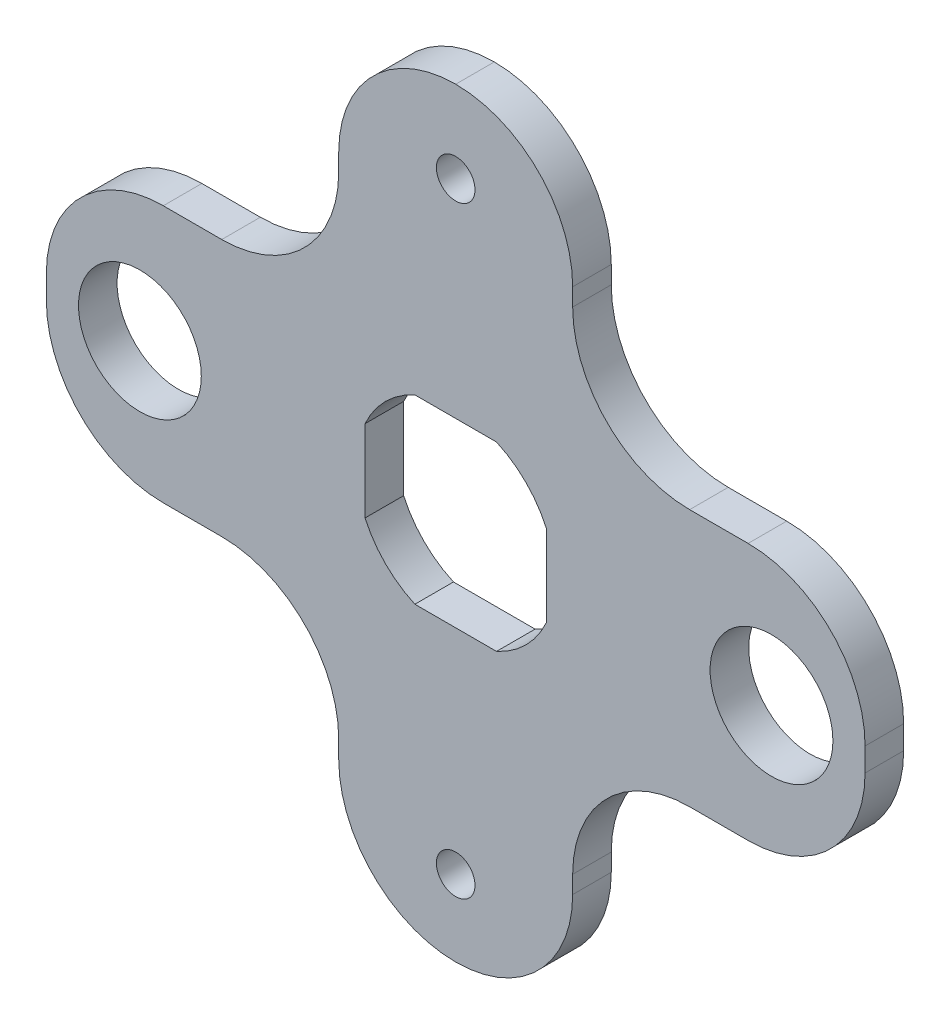
ISO-10303-21;
HEADER;
FILE_DESCRIPTION(('STEP AP214'),'2;1');
FILE_NAME('part.step','',(''),(''),'','','');
FILE_SCHEMA(('AUTOMOTIVE_DESIGN { 1 0 10303 214 1 1 1 1 }'));
ENDSEC;
DATA;
#1=APPLICATION_CONTEXT('core data for automotive mechanical design processes');
#2=APPLICATION_PROTOCOL_DEFINITION('international standard','automotive_design',2000,#1);
#3=PRODUCT_CONTEXT('',#1,'mechanical');
#4=PRODUCT('Part','Part','',(#3));
#5=PRODUCT_RELATED_PRODUCT_CATEGORY('part','',(#4));
#6=PRODUCT_DEFINITION_FORMATION('','',#4);
#7=PRODUCT_DEFINITION_CONTEXT('part definition',#1,'design');
#8=PRODUCT_DEFINITION('design','',#6,#7);
#9=PRODUCT_DEFINITION_SHAPE('','',#8);
#10=(LENGTH_UNIT() NAMED_UNIT(*) SI_UNIT(.MILLI.,.METRE.));
#11=(NAMED_UNIT(*) PLANE_ANGLE_UNIT() SI_UNIT($,.RADIAN.));
#12=(NAMED_UNIT(*) SI_UNIT($,.STERADIAN.) SOLID_ANGLE_UNIT());
#13=UNCERTAINTY_MEASURE_WITH_UNIT(LENGTH_MEASURE(1.E-05),#10,'distance_accuracy_value','');
#14=(GEOMETRIC_REPRESENTATION_CONTEXT(3) GLOBAL_UNCERTAINTY_ASSIGNED_CONTEXT((#13)) GLOBAL_UNIT_ASSIGNED_CONTEXT((#10,
#11,#12)) REPRESENTATION_CONTEXT('',''));
#15=CARTESIAN_POINT('',(0.,0.,0.));
#16=DIRECTION('',(0.,0.,1.));
#17=DIRECTION('',(1.,0.,0.));
#18=AXIS2_PLACEMENT_3D('',#15,#16,#17);
#19=CARTESIAN_POINT('',(0.,-3.25,3.3));
#20=DIRECTION('',(0.,-1.,0.));
#21=DIRECTION('',(1.,0.,0.));
#22=AXIS2_PLACEMENT_3D('',#19,#20,#21);
#23=PLANE('',#22);
#24=DIRECTION('',(-1.,0.,0.));
#25=VECTOR('',#24,1.);
#26=CARTESIAN_POINT('',(0.,-3.25,3.3));
#27=LINE('',#26,#25);
#28=CARTESIAN_POINT('',(-12.25,-3.25,3.3));
#29=VERTEX_POINT('',#28);
#30=CARTESIAN_POINT('',(-17.25,-3.25,3.3));
#31=VERTEX_POINT('',#30);
#32=EDGE_CURVE('E293',#29,#31,#27,.T.);
#33=ORIENTED_EDGE('',*,*,#32,.T.);
#34=DIRECTION('',(0.,0.,-1.));
#35=VECTOR('',#34,1.);
#36=CARTESIAN_POINT('',(-17.25,-3.25,3.3));
#37=LINE('',#36,#35);
#38=CARTESIAN_POINT('',(-17.25,-3.25,0.));
#39=VERTEX_POINT('',#38);
#40=EDGE_CURVE('E440',#31,#39,#37,.T.);
#41=ORIENTED_EDGE('',*,*,#40,.T.);
#42=DIRECTION('',(-1.,0.,0.));
#43=VECTOR('',#42,1.);
#44=CARTESIAN_POINT('',(0.,-3.25,0.));
#45=LINE('',#44,#43);
#46=CARTESIAN_POINT('',(-12.25,-3.25,0.));
#47=VERTEX_POINT('',#46);
#48=EDGE_CURVE('E357',#47,#39,#45,.T.);
#49=ORIENTED_EDGE('',*,*,#48,.F.);
#50=DIRECTION('',(0.,0.,-1.));
#51=VECTOR('',#50,1.);
#52=CARTESIAN_POINT('',(-12.25,-3.25,3.3));
#53=LINE('',#52,#51);
#54=EDGE_CURVE('E438',#47,#29,#53,.F.);
#55=ORIENTED_EDGE('',*,*,#54,.T.);
#56=EDGE_LOOP('',(#33,#41,#49,#55));
#57=FACE_BOUND('',#56,.T.);
#58=ADVANCED_FACE('F39',(#57),#23,.T.);
#59=CARTESIAN_POINT('',(-2.25,0.,3.3));
#60=DIRECTION('',(-1.,0.,0.));
#61=DIRECTION('',(0.,-1.,0.));
#62=AXIS2_PLACEMENT_3D('',#59,#60,#61);
#63=PLANE('',#62);
#64=DIRECTION('',(0.,1.,0.));
#65=VECTOR('',#64,1.);
#66=CARTESIAN_POINT('',(-2.25,0.,3.3));
#67=LINE('',#66,#65);
#68=CARTESIAN_POINT('',(-2.25,-14.75,3.3));
#69=VERTEX_POINT('',#68);
#70=CARTESIAN_POINT('',(-2.25,-13.25,3.3));
#71=VERTEX_POINT('',#70);
#72=EDGE_CURVE('E296',#69,#71,#67,.T.);
#73=ORIENTED_EDGE('',*,*,#72,.T.);
#74=DIRECTION('',(0.,0.,-1.));
#75=VECTOR('',#74,1.);
#76=CARTESIAN_POINT('',(-2.25,-13.25,0.));
#77=LINE('',#76,#75);
#78=CARTESIAN_POINT('',(-2.25,-13.25,0.));
#79=VERTEX_POINT('',#78);
#80=EDGE_CURVE('E446',#71,#79,#77,.T.);
#81=ORIENTED_EDGE('',*,*,#80,.T.);
#82=DIRECTION('',(0.,1.,0.));
#83=VECTOR('',#82,1.);
#84=CARTESIAN_POINT('',(-2.25,0.,0.));
#85=LINE('',#84,#83);
#86=CARTESIAN_POINT('',(-2.25,-14.75,0.));
#87=VERTEX_POINT('',#86);
#88=EDGE_CURVE('E360',#87,#79,#85,.T.);
#89=ORIENTED_EDGE('',*,*,#88,.F.);
#90=DIRECTION('',(0.,0.,-1.));
#91=VECTOR('',#90,1.);
#92=CARTESIAN_POINT('',(-2.25,-14.75,3.3));
#93=LINE('',#92,#91);
#94=EDGE_CURVE('E443',#87,#69,#93,.F.);
#95=ORIENTED_EDGE('',*,*,#94,.T.);
#96=EDGE_LOOP('',(#73,#81,#89,#95));
#97=FACE_BOUND('',#96,.T.);
#98=ADVANCED_FACE('F552',(#97),#63,.T.);
#99=CARTESIAN_POINT('',(17.75,0.,3.3));
#100=DIRECTION('',(1.,0.,0.));
#101=DIRECTION('',(0.,0.,-1.));
#102=AXIS2_PLACEMENT_3D('',#99,#100,#101);
#103=PLANE('',#102);
#104=DIRECTION('',(0.,-1.,0.));
#105=VECTOR('',#104,1.);
#106=CARTESIAN_POINT('',(17.75,0.,3.3));
#107=LINE('',#106,#105);
#108=CARTESIAN_POINT('',(17.75,-13.25,3.3));
#109=VERTEX_POINT('',#108);
#110=CARTESIAN_POINT('',(17.75,-14.75,3.3));
#111=VERTEX_POINT('',#110);
#112=EDGE_CURVE('E299',#109,#111,#107,.T.);
#113=ORIENTED_EDGE('',*,*,#112,.T.);
#114=DIRECTION('',(0.,0.,-1.));
#115=VECTOR('',#114,1.);
#116=CARTESIAN_POINT('',(17.75,-14.75,3.3));
#117=LINE('',#116,#115);
#118=CARTESIAN_POINT('',(17.75,-14.75,0.));
#119=VERTEX_POINT('',#118);
#120=EDGE_CURVE('E451',#111,#119,#117,.T.);
#121=ORIENTED_EDGE('',*,*,#120,.T.);
#122=DIRECTION('',(0.,-1.,0.));
#123=VECTOR('',#122,1.);
#124=CARTESIAN_POINT('',(17.75,0.,0.));
#125=LINE('',#124,#123);
#126=CARTESIAN_POINT('',(17.75,-13.25,0.));
#127=VERTEX_POINT('',#126);
#128=EDGE_CURVE('E363',#127,#119,#125,.T.);
#129=ORIENTED_EDGE('',*,*,#128,.F.);
#130=DIRECTION('',(0.,0.,-1.));
#131=VECTOR('',#130,1.);
#132=CARTESIAN_POINT('',(17.75,-13.25,3.3));
#133=LINE('',#132,#131);
#134=EDGE_CURVE('E449',#127,#109,#133,.F.);
#135=ORIENTED_EDGE('',*,*,#134,.T.);
#136=EDGE_LOOP('',(#113,#121,#129,#135));
#137=FACE_BOUND('',#136,.T.);
#138=ADVANCED_FACE('F543',(#137),#103,.T.);
#139=CARTESIAN_POINT('',(0.,-3.25,3.3));
#140=DIRECTION('',(0.,-1.,0.));
#141=DIRECTION('',(1.,0.,0.));
#142=AXIS2_PLACEMENT_3D('',#139,#140,#141);
#143=PLANE('',#142);
#144=DIRECTION('',(-1.,0.,0.));
#145=VECTOR('',#144,1.);
#146=CARTESIAN_POINT('',(0.,-3.25,3.3));
#147=LINE('',#146,#145);
#148=CARTESIAN_POINT('',(32.75,-3.25,3.3));
#149=VERTEX_POINT('',#148);
#150=CARTESIAN_POINT('',(27.75,-3.25,3.3));
#151=VERTEX_POINT('',#150);
#152=EDGE_CURVE('E302',#149,#151,#147,.T.);
#153=ORIENTED_EDGE('',*,*,#152,.T.);
#154=DIRECTION('',(0.,0.,-1.));
#155=VECTOR('',#154,1.);
#156=CARTESIAN_POINT('',(27.75,-3.25,0.));
#157=LINE('',#156,#155);
#158=CARTESIAN_POINT('',(27.75,-3.25,0.));
#159=VERTEX_POINT('',#158);
#160=EDGE_CURVE('E455',#151,#159,#157,.T.);
#161=ORIENTED_EDGE('',*,*,#160,.T.);
#162=DIRECTION('',(-1.,0.,0.));
#163=VECTOR('',#162,1.);
#164=CARTESIAN_POINT('',(0.,-3.25,0.));
#165=LINE('',#164,#163);
#166=CARTESIAN_POINT('',(32.75,-3.25,0.));
#167=VERTEX_POINT('',#166);
#168=EDGE_CURVE('E366',#167,#159,#165,.T.);
#169=ORIENTED_EDGE('',*,*,#168,.F.);
#170=DIRECTION('',(0.,0.,-1.));
#171=VECTOR('',#170,1.);
#172=CARTESIAN_POINT('',(32.75,-3.25,3.3));
#173=LINE('',#172,#171);
#174=EDGE_CURVE('E453',#167,#149,#173,.F.);
#175=ORIENTED_EDGE('',*,*,#174,.T.);
#176=EDGE_LOOP('',(#153,#161,#169,#175));
#177=FACE_BOUND('',#176,.T.);
#178=ADVANCED_FACE('F533',(#177),#143,.T.);
#179=CARTESIAN_POINT('',(42.75,0.,3.3));
#180=DIRECTION('',(1.,0.,0.));
#181=DIRECTION('',(0.,0.,-1.));
#182=AXIS2_PLACEMENT_3D('',#179,#180,#181);
#183=PLANE('',#182);
#184=DIRECTION('',(0.,-1.,0.));
#185=VECTOR('',#184,1.);
#186=CARTESIAN_POINT('',(42.75,0.,3.3));
#187=LINE('',#186,#185);
#188=CARTESIAN_POINT('',(42.75,8.75,3.3));
#189=VERTEX_POINT('',#188);
#190=CARTESIAN_POINT('',(42.75,6.75,3.3));
#191=VERTEX_POINT('',#190);
#192=EDGE_CURVE('E305',#189,#191,#187,.T.);
#193=ORIENTED_EDGE('',*,*,#192,.T.);
#194=DIRECTION('',(0.,0.,-1.));
#195=VECTOR('',#194,1.);
#196=CARTESIAN_POINT('',(42.75,6.75,3.3));
#197=LINE('',#196,#195);
#198=CARTESIAN_POINT('',(42.75,6.75,0.));
#199=VERTEX_POINT('',#198);
#200=EDGE_CURVE('E460',#191,#199,#197,.T.);
#201=ORIENTED_EDGE('',*,*,#200,.T.);
#202=DIRECTION('',(0.,-1.,0.));
#203=VECTOR('',#202,1.);
#204=CARTESIAN_POINT('',(42.75,0.,0.));
#205=LINE('',#204,#203);
#206=CARTESIAN_POINT('',(42.75,8.75,0.));
#207=VERTEX_POINT('',#206);
#208=EDGE_CURVE('E369',#207,#199,#205,.T.);
#209=ORIENTED_EDGE('',*,*,#208,.F.);
#210=DIRECTION('',(0.,0.,-1.));
#211=VECTOR('',#210,1.);
#212=CARTESIAN_POINT('',(42.75,8.75,3.3));
#213=LINE('',#212,#211);
#214=EDGE_CURVE('E458',#207,#189,#213,.F.);
#215=ORIENTED_EDGE('',*,*,#214,.T.);
#216=EDGE_LOOP('',(#193,#201,#209,#215));
#217=FACE_BOUND('',#216,.T.);
#218=ADVANCED_FACE('F524',(#217),#183,.T.);
#219=CARTESIAN_POINT('',(0.,18.75,3.3));
#220=DIRECTION('',(0.,1.,0.));
#221=DIRECTION('',(0.,0.,1.));
#222=AXIS2_PLACEMENT_3D('',#219,#220,#221);
#223=PLANE('',#222);
#224=DIRECTION('',(1.,0.,0.));
#225=VECTOR('',#224,1.);
#226=CARTESIAN_POINT('',(0.,18.75,3.3));
#227=LINE('',#226,#225);
#228=CARTESIAN_POINT('',(27.75,18.75,3.3));
#229=VERTEX_POINT('',#228);
#230=CARTESIAN_POINT('',(32.75,18.75,3.3));
#231=VERTEX_POINT('',#230);
#232=EDGE_CURVE('E308',#229,#231,#227,.T.);
#233=ORIENTED_EDGE('',*,*,#232,.T.);
#234=DIRECTION('',(0.,0.,-1.));
#235=VECTOR('',#234,1.);
#236=CARTESIAN_POINT('',(32.75,18.75,3.3));
#237=LINE('',#236,#235);
#238=CARTESIAN_POINT('',(32.75,18.75,0.));
#239=VERTEX_POINT('',#238);
#240=EDGE_CURVE('E465',#231,#239,#237,.T.);
#241=ORIENTED_EDGE('',*,*,#240,.T.);
#242=DIRECTION('',(1.,0.,0.));
#243=VECTOR('',#242,1.);
#244=CARTESIAN_POINT('',(0.,18.75,0.));
#245=LINE('',#244,#243);
#246=CARTESIAN_POINT('',(27.75,18.75,0.));
#247=VERTEX_POINT('',#246);
#248=EDGE_CURVE('E372',#247,#239,#245,.T.);
#249=ORIENTED_EDGE('',*,*,#248,.F.);
#250=DIRECTION('',(0.,0.,-1.));
#251=VECTOR('',#250,1.);
#252=CARTESIAN_POINT('',(27.75,18.75,3.3));
#253=LINE('',#252,#251);
#254=EDGE_CURVE('E463',#247,#229,#253,.F.);
#255=ORIENTED_EDGE('',*,*,#254,.T.);
#256=EDGE_LOOP('',(#233,#241,#249,#255));
#257=FACE_BOUND('',#256,.T.);
#258=ADVANCED_FACE('F515',(#257),#223,.T.);
#259=CARTESIAN_POINT('',(17.75,0.,3.3));
#260=DIRECTION('',(1.,0.,0.));
#261=DIRECTION('',(0.,0.,-1.));
#262=AXIS2_PLACEMENT_3D('',#259,#260,#261);
#263=PLANE('',#262);
#264=DIRECTION('',(0.,-1.,0.));
#265=VECTOR('',#264,1.);
#266=CARTESIAN_POINT('',(17.75,0.,3.3));
#267=LINE('',#266,#265);
#268=CARTESIAN_POINT('',(17.75,30.25,3.3));
#269=VERTEX_POINT('',#268);
#270=CARTESIAN_POINT('',(17.75,28.75,3.3));
#271=VERTEX_POINT('',#270);
#272=EDGE_CURVE('E311',#269,#271,#267,.T.);
#273=ORIENTED_EDGE('',*,*,#272,.T.);
#274=DIRECTION('',(0.,0.,-1.));
#275=VECTOR('',#274,1.);
#276=CARTESIAN_POINT('',(17.75,28.75,0.));
#277=LINE('',#276,#275);
#278=CARTESIAN_POINT('',(17.75,28.75,0.));
#279=VERTEX_POINT('',#278);
#280=EDGE_CURVE('E470',#271,#279,#277,.T.);
#281=ORIENTED_EDGE('',*,*,#280,.T.);
#282=DIRECTION('',(0.,-1.,0.));
#283=VECTOR('',#282,1.);
#284=CARTESIAN_POINT('',(17.75,0.,0.));
#285=LINE('',#284,#283);
#286=CARTESIAN_POINT('',(17.75,30.25,0.));
#287=VERTEX_POINT('',#286);
#288=EDGE_CURVE('E375',#287,#279,#285,.T.);
#289=ORIENTED_EDGE('',*,*,#288,.F.);
#290=DIRECTION('',(0.,0.,-1.));
#291=VECTOR('',#290,1.);
#292=CARTESIAN_POINT('',(17.75,30.25,3.3));
#293=LINE('',#292,#291);
#294=EDGE_CURVE('E468',#287,#269,#293,.F.);
#295=ORIENTED_EDGE('',*,*,#294,.T.);
#296=EDGE_LOOP('',(#273,#281,#289,#295));
#297=FACE_BOUND('',#296,.T.);
#298=ADVANCED_FACE('F506',(#297),#263,.T.);
#299=CARTESIAN_POINT('',(-2.25,0.,3.3));
#300=DIRECTION('',(-1.,0.,0.));
#301=DIRECTION('',(0.,-1.,0.));
#302=AXIS2_PLACEMENT_3D('',#299,#300,#301);
#303=PLANE('',#302);
#304=DIRECTION('',(0.,1.,0.));
#305=VECTOR('',#304,1.);
#306=CARTESIAN_POINT('',(-2.25,0.,0.));
#307=LINE('',#306,#305);
#308=CARTESIAN_POINT('',(-2.25,28.75,0.));
#309=VERTEX_POINT('',#308);
#310=CARTESIAN_POINT('',(-2.25,30.25,0.));
#311=VERTEX_POINT('',#310);
#312=EDGE_CURVE('E378',#309,#311,#307,.T.);
#313=ORIENTED_EDGE('',*,*,#312,.F.);
#314=DIRECTION('',(0.,0.,-1.));
#315=VECTOR('',#314,1.);
#316=CARTESIAN_POINT('',(-2.25,28.75,3.3));
#317=LINE('',#316,#315);
#318=CARTESIAN_POINT('',(-2.25,28.75,3.3));
#319=VERTEX_POINT('',#318);
#320=EDGE_CURVE('E63',#309,#319,#317,.F.);
#321=ORIENTED_EDGE('',*,*,#320,.T.);
#322=DIRECTION('',(0.,1.,0.));
#323=VECTOR('',#322,1.);
#324=CARTESIAN_POINT('',(-2.25,0.,3.3));
#325=LINE('',#324,#323);
#326=CARTESIAN_POINT('',(-2.25,30.25,3.3));
#327=VERTEX_POINT('',#326);
#328=EDGE_CURVE('E314',#319,#327,#325,.T.);
#329=ORIENTED_EDGE('',*,*,#328,.T.);
#330=DIRECTION('',(0.,0.,-1.));
#331=VECTOR('',#330,1.);
#332=CARTESIAN_POINT('',(-2.25,30.25,3.3));
#333=LINE('',#332,#331);
#334=EDGE_CURVE('E473',#327,#311,#333,.T.);
#335=ORIENTED_EDGE('',*,*,#334,.T.);
#336=EDGE_LOOP('',(#313,#321,#329,#335));
#337=FACE_BOUND('',#336,.T.);
#338=ADVANCED_FACE('F585',(#337),#303,.T.);
#339=CARTESIAN_POINT('',(0.,18.75,3.3));
#340=DIRECTION('',(0.,1.,0.));
#341=DIRECTION('',(0.,0.,1.));
#342=AXIS2_PLACEMENT_3D('',#339,#340,#341);
#343=PLANE('',#342);
#344=DIRECTION('',(1.,0.,0.));
#345=VECTOR('',#344,1.);
#346=CARTESIAN_POINT('',(0.,18.75,0.));
#347=LINE('',#346,#345);
#348=CARTESIAN_POINT('',(-17.25,18.75,0.));
#349=VERTEX_POINT('',#348);
#350=CARTESIAN_POINT('',(-12.25,18.75,0.));
#351=VERTEX_POINT('',#350);
#352=EDGE_CURVE('E381',#349,#351,#347,.T.);
#353=ORIENTED_EDGE('',*,*,#352,.F.);
#354=DIRECTION('',(0.,0.,-1.));
#355=VECTOR('',#354,1.);
#356=CARTESIAN_POINT('',(-17.25,18.75,3.3));
#357=LINE('',#356,#355);
#358=CARTESIAN_POINT('',(-17.25,18.75,3.3));
#359=VERTEX_POINT('',#358);
#360=EDGE_CURVE('E421',#349,#359,#357,.F.);
#361=ORIENTED_EDGE('',*,*,#360,.T.);
#362=DIRECTION('',(1.,0.,0.));
#363=VECTOR('',#362,1.);
#364=CARTESIAN_POINT('',(0.,18.75,3.3));
#365=LINE('',#364,#363);
#366=CARTESIAN_POINT('',(-12.25,18.75,3.3));
#367=VERTEX_POINT('',#366);
#368=EDGE_CURVE('E316',#359,#367,#365,.T.);
#369=ORIENTED_EDGE('',*,*,#368,.T.);
#370=DIRECTION('',(0.,0.,-1.));
#371=VECTOR('',#370,1.);
#372=CARTESIAN_POINT('',(-12.25,18.75,0.));
#373=LINE('',#372,#371);
#374=EDGE_CURVE('E418',#367,#351,#373,.T.);
#375=ORIENTED_EDGE('',*,*,#374,.T.);
#376=EDGE_LOOP('',(#353,#361,#369,#375));
#377=FACE_BOUND('',#376,.T.);
#378=ADVANCED_FACE('F580',(#377),#343,.T.);
#379=CARTESIAN_POINT('',(7.75,7.75,3.3));
#380=DIRECTION('',(0.,0.,-1.));
#381=DIRECTION('',(-1.,0.,0.));
#382=AXIS2_PLACEMENT_3D('',#379,#380,#381);
#383=CYLINDRICAL_SURFACE('',#382,8.5);
#384=CARTESIAN_POINT('',(7.75,7.75,0.));
#385=DIRECTION('',(0.,0.,1.));
#386=DIRECTION('',(1.,0.,0.));
#387=AXIS2_PLACEMENT_3D('',#384,#385,#386);
#388=CIRCLE('',#387,8.5);
#389=CARTESIAN_POINT('',(15.5,11.2410600109422,0.));
#390=VERTEX_POINT('',#389);
#391=CARTESIAN_POINT('',(11.2410600109422,15.5,0.));
#392=VERTEX_POINT('',#391);
#393=EDGE_CURVE('E243',#390,#392,#388,.T.);
#394=ORIENTED_EDGE('',*,*,#393,.F.);
#395=DIRECTION('',(0.,0.,-1.));
#396=VECTOR('',#395,1.);
#397=CARTESIAN_POINT('',(15.5,11.2410600109422,3.3));
#398=LINE('',#397,#396);
#399=CARTESIAN_POINT('',(15.5,11.2410600109422,3.3));
#400=VERTEX_POINT('',#399);
#401=EDGE_CURVE('E238',#400,#390,#398,.T.);
#402=ORIENTED_EDGE('',*,*,#401,.F.);
#403=CARTESIAN_POINT('',(7.75,7.75,3.3));
#404=DIRECTION('',(0.,0.,1.));
#405=DIRECTION('',(1.,0.,0.));
#406=AXIS2_PLACEMENT_3D('',#403,#404,#405);
#407=CIRCLE('',#406,8.5);
#408=CARTESIAN_POINT('',(11.2410600109422,15.5,3.3));
#409=VERTEX_POINT('',#408);
#410=EDGE_CURVE('E241',#400,#409,#407,.T.);
#411=ORIENTED_EDGE('',*,*,#410,.T.);
#412=DIRECTION('',(0.,0.,-1.));
#413=VECTOR('',#412,1.);
#414=CARTESIAN_POINT('',(11.2410600109422,15.5,3.3));
#415=LINE('',#414,#413);
#416=EDGE_CURVE('E322',#409,#392,#415,.T.);
#417=ORIENTED_EDGE('',*,*,#416,.T.);
#418=EDGE_LOOP('',(#394,#402,#411,#417));
#419=FACE_BOUND('',#418,.T.);
#420=ADVANCED_FACE('F240',(#419),#383,.F.);
#421=CARTESIAN_POINT('',(15.5,0.,3.3));
#422=DIRECTION('',(-1.,0.,0.));
#423=DIRECTION('',(0.,0.,1.));
#424=AXIS2_PLACEMENT_3D('',#421,#422,#423);
#425=PLANE('',#424);
#426=DIRECTION('',(0.,1.,0.));
#427=VECTOR('',#426,1.);
#428=CARTESIAN_POINT('',(15.5,0.,0.));
#429=LINE('',#428,#427);
#430=CARTESIAN_POINT('',(15.5,4.25893998905776,0.));
#431=VERTEX_POINT('',#430);
#432=EDGE_CURVE('E324',#431,#390,#429,.T.);
#433=ORIENTED_EDGE('',*,*,#432,.F.);
#434=DIRECTION('',(0.,0.,-1.));
#435=VECTOR('',#434,1.);
#436=CARTESIAN_POINT('',(15.5,4.25893998905776,3.3));
#437=LINE('',#436,#435);
#438=CARTESIAN_POINT('',(15.5,4.25893998905776,3.3));
#439=VERTEX_POINT('',#438);
#440=EDGE_CURVE('E249',#439,#431,#437,.T.);
#441=ORIENTED_EDGE('',*,*,#440,.F.);
#442=DIRECTION('',(0.,1.,0.));
#443=VECTOR('',#442,1.);
#444=CARTESIAN_POINT('',(15.5,0.,3.3));
#445=LINE('',#444,#443);
#446=EDGE_CURVE('E256',#439,#400,#445,.T.);
#447=ORIENTED_EDGE('',*,*,#446,.T.);
#448=ORIENTED_EDGE('',*,*,#401,.T.);
#449=EDGE_LOOP('',(#433,#441,#447,#448));
#450=FACE_BOUND('',#449,.T.);
#451=ADVANCED_FACE('F264',(#450),#425,.T.);
#452=CARTESIAN_POINT('',(7.75,7.75,3.3));
#453=DIRECTION('',(0.,0.,-1.));
#454=DIRECTION('',(-1.,0.,0.));
#455=AXIS2_PLACEMENT_3D('',#452,#453,#454);
#456=CYLINDRICAL_SURFACE('',#455,8.5);
#457=CARTESIAN_POINT('',(7.75,7.75,0.));
#458=DIRECTION('',(0.,0.,1.));
#459=DIRECTION('',(1.,0.,0.));
#460=AXIS2_PLACEMENT_3D('',#457,#458,#459);
#461=CIRCLE('',#460,8.5);
#462=CARTESIAN_POINT('',(11.2410600109422,0.,0.));
#463=VERTEX_POINT('',#462);
#464=EDGE_CURVE('E327',#463,#431,#461,.T.);
#465=ORIENTED_EDGE('',*,*,#464,.F.);
#466=DIRECTION('',(0.,0.,-1.));
#467=VECTOR('',#466,1.);
#468=CARTESIAN_POINT('',(11.2410600109422,0.,3.3));
#469=LINE('',#468,#467);
#470=CARTESIAN_POINT('',(11.2410600109422,0.,3.3));
#471=VERTEX_POINT('',#470);
#472=EDGE_CURVE('E395',#471,#463,#469,.T.);
#473=ORIENTED_EDGE('',*,*,#472,.F.);
#474=CARTESIAN_POINT('',(7.75,7.75,3.3));
#475=DIRECTION('',(0.,0.,1.));
#476=DIRECTION('',(1.,0.,0.));
#477=AXIS2_PLACEMENT_3D('',#474,#475,#476);
#478=CIRCLE('',#477,8.5);
#479=EDGE_CURVE('E265',#471,#439,#478,.T.);
#480=ORIENTED_EDGE('',*,*,#479,.T.);
#481=ORIENTED_EDGE('',*,*,#440,.T.);
#482=EDGE_LOOP('',(#465,#473,#480,#481));
#483=FACE_BOUND('',#482,.T.);
#484=ADVANCED_FACE('F637',(#483),#456,.F.);
#485=CARTESIAN_POINT('',(0.,0.,3.3));
#486=DIRECTION('',(0.,1.,0.));
#487=DIRECTION('',(0.,0.,1.));
#488=AXIS2_PLACEMENT_3D('',#485,#486,#487);
#489=PLANE('',#488);
#490=DIRECTION('',(1.,0.,0.));
#491=VECTOR('',#490,1.);
#492=CARTESIAN_POINT('',(0.,0.,0.));
#493=LINE('',#492,#491);
#494=CARTESIAN_POINT('',(4.25893998905776,0.,0.));
#495=VERTEX_POINT('',#494);
#496=EDGE_CURVE('E330',#495,#463,#493,.T.);
#497=ORIENTED_EDGE('',*,*,#496,.F.);
#498=DIRECTION('',(0.,0.,-1.));
#499=VECTOR('',#498,1.);
#500=CARTESIAN_POINT('',(4.25893998905776,0.,3.3));
#501=LINE('',#500,#499);
#502=CARTESIAN_POINT('',(4.25893998905776,0.,3.3));
#503=VERTEX_POINT('',#502);
#504=EDGE_CURVE('E393',#503,#495,#501,.T.);
#505=ORIENTED_EDGE('',*,*,#504,.F.);
#506=DIRECTION('',(1.,0.,0.));
#507=VECTOR('',#506,1.);
#508=CARTESIAN_POINT('',(0.,0.,3.3));
#509=LINE('',#508,#507);
#510=EDGE_CURVE('E267',#503,#471,#509,.T.);
#511=ORIENTED_EDGE('',*,*,#510,.T.);
#512=ORIENTED_EDGE('',*,*,#472,.T.);
#513=EDGE_LOOP('',(#497,#505,#511,#512));
#514=FACE_BOUND('',#513,.T.);
#515=ADVANCED_FACE('F633',(#514),#489,.T.);
#516=CARTESIAN_POINT('',(7.75,7.75,3.3));
#517=DIRECTION('',(0.,0.,-1.));
#518=DIRECTION('',(-1.,0.,0.));
#519=AXIS2_PLACEMENT_3D('',#516,#517,#518);
#520=CYLINDRICAL_SURFACE('',#519,8.5);
#521=CARTESIAN_POINT('',(7.75,7.75,0.));
#522=DIRECTION('',(0.,0.,1.));
#523=DIRECTION('',(1.,0.,0.));
#524=AXIS2_PLACEMENT_3D('',#521,#522,#523);
#525=CIRCLE('',#524,8.5);
#526=CARTESIAN_POINT('',(0.,4.25893998905776,0.));
#527=VERTEX_POINT('',#526);
#528=EDGE_CURVE('E333',#527,#495,#525,.T.);
#529=ORIENTED_EDGE('',*,*,#528,.F.);
#530=DIRECTION('',(0.,0.,-1.));
#531=VECTOR('',#530,1.);
#532=CARTESIAN_POINT('',(0.,4.25893998905776,3.3));
#533=LINE('',#532,#531);
#534=CARTESIAN_POINT('',(0.,4.25893998905776,3.3));
#535=VERTEX_POINT('',#534);
#536=EDGE_CURVE('E391',#535,#527,#533,.T.);
#537=ORIENTED_EDGE('',*,*,#536,.F.);
#538=CARTESIAN_POINT('',(7.75,7.75,3.3));
#539=DIRECTION('',(0.,0.,1.));
#540=DIRECTION('',(1.,0.,0.));
#541=AXIS2_PLACEMENT_3D('',#538,#539,#540);
#542=CIRCLE('',#541,8.5);
#543=EDGE_CURVE('E272',#535,#503,#542,.T.);
#544=ORIENTED_EDGE('',*,*,#543,.T.);
#545=ORIENTED_EDGE('',*,*,#504,.T.);
#546=EDGE_LOOP('',(#529,#537,#544,#545));
#547=FACE_BOUND('',#546,.T.);
#548=ADVANCED_FACE('F629',(#547),#520,.F.);
#549=CARTESIAN_POINT('',(0.,0.,3.3));
#550=DIRECTION('',(-1.,0.,0.));
#551=DIRECTION('',(0.,0.,1.));
#552=AXIS2_PLACEMENT_3D('',#549,#550,#551);
#553=PLANE('',#552);
#554=DIRECTION('',(0.,1.,0.));
#555=VECTOR('',#554,1.);
#556=CARTESIAN_POINT('',(0.,0.,0.));
#557=LINE('',#556,#555);
#558=CARTESIAN_POINT('',(0.,11.2410600109422,0.));
#559=VERTEX_POINT('',#558);
#560=EDGE_CURVE('E336',#527,#559,#557,.T.);
#561=ORIENTED_EDGE('',*,*,#560,.T.);
#562=DIRECTION('',(0.,0.,-1.));
#563=VECTOR('',#562,1.);
#564=CARTESIAN_POINT('',(0.,11.2410600109422,3.3));
#565=LINE('',#564,#563);
#566=CARTESIAN_POINT('',(0.,11.2410600109422,3.3));
#567=VERTEX_POINT('',#566);
#568=EDGE_CURVE('E389',#567,#559,#565,.T.);
#569=ORIENTED_EDGE('',*,*,#568,.F.);
#570=DIRECTION('',(0.,1.,0.));
#571=VECTOR('',#570,1.);
#572=CARTESIAN_POINT('',(0.,0.,3.3));
#573=LINE('',#572,#571);
#574=EDGE_CURVE('E275',#535,#567,#573,.T.);
#575=ORIENTED_EDGE('',*,*,#574,.F.);
#576=ORIENTED_EDGE('',*,*,#536,.T.);
#577=EDGE_LOOP('',(#561,#569,#575,#576));
#578=FACE_BOUND('',#577,.T.);
#579=ADVANCED_FACE('F625',(#578),#553,.F.);
#580=CARTESIAN_POINT('',(7.75,7.75,3.3));
#581=DIRECTION('',(0.,0.,-1.));
#582=DIRECTION('',(-1.,0.,0.));
#583=AXIS2_PLACEMENT_3D('',#580,#581,#582);
#584=CYLINDRICAL_SURFACE('',#583,8.5);
#585=CARTESIAN_POINT('',(7.75,7.75,0.));
#586=DIRECTION('',(0.,0.,1.));
#587=DIRECTION('',(1.,0.,0.));
#588=AXIS2_PLACEMENT_3D('',#585,#586,#587);
#589=CIRCLE('',#588,8.5);
#590=CARTESIAN_POINT('',(4.25893998905776,15.5,0.));
#591=VERTEX_POINT('',#590);
#592=EDGE_CURVE('E339',#591,#559,#589,.T.);
#593=ORIENTED_EDGE('',*,*,#592,.F.);
#594=DIRECTION('',(0.,0.,-1.));
#595=VECTOR('',#594,1.);
#596=CARTESIAN_POINT('',(4.25893998905776,15.5,3.3));
#597=LINE('',#596,#595);
#598=CARTESIAN_POINT('',(4.25893998905776,15.5,3.3));
#599=VERTEX_POINT('',#598);
#600=EDGE_CURVE('E387',#599,#591,#597,.T.);
#601=ORIENTED_EDGE('',*,*,#600,.F.);
#602=CARTESIAN_POINT('',(7.75,7.75,3.3));
#603=DIRECTION('',(0.,0.,1.));
#604=DIRECTION('',(1.,0.,0.));
#605=AXIS2_PLACEMENT_3D('',#602,#603,#604);
#606=CIRCLE('',#605,8.5);
#607=EDGE_CURVE('E277',#599,#567,#606,.T.);
#608=ORIENTED_EDGE('',*,*,#607,.T.);
#609=ORIENTED_EDGE('',*,*,#568,.T.);
#610=EDGE_LOOP('',(#593,#601,#608,#609));
#611=FACE_BOUND('',#610,.T.);
#612=ADVANCED_FACE('F606',(#611),#584,.F.);
#613=CARTESIAN_POINT('',(34.75,7.75,3.3));
#614=DIRECTION('',(0.,0.,-1.));
#615=DIRECTION('',(-1.,0.,0.));
#616=AXIS2_PLACEMENT_3D('',#613,#614,#615);
#617=CYLINDRICAL_SURFACE('',#616,5.25);
#618=CARTESIAN_POINT('',(34.75,7.75,3.3));
#619=DIRECTION('',(0.,0.,1.));
#620=DIRECTION('',(1.,0.,0.));
#621=AXIS2_PLACEMENT_3D('',#618,#619,#620);
#622=CIRCLE('',#621,5.25);
#623=CARTESIAN_POINT('',(40.,7.75,3.3));
#624=VERTEX_POINT('',#623);
#625=EDGE_CURVE('E290',#624,#624,#622,.T.);
#626=ORIENTED_EDGE('',*,*,#625,.T.);
#627=EDGE_LOOP('',(#626));
#628=FACE_BOUND('',#627,.T.);
#629=CARTESIAN_POINT('',(34.75,7.75,0.));
#630=DIRECTION('',(0.,0.,1.));
#631=DIRECTION('',(1.,0.,0.));
#632=AXIS2_PLACEMENT_3D('',#629,#630,#631);
#633=CIRCLE('',#632,5.25);
#634=CARTESIAN_POINT('',(40.,7.75,0.));
#635=VERTEX_POINT('',#634);
#636=EDGE_CURVE('E354',#635,#635,#633,.T.);
#637=ORIENTED_EDGE('',*,*,#636,.F.);
#638=EDGE_LOOP('',(#637));
#639=FACE_BOUND('',#638,.T.);
#640=ADVANCED_FACE('F602',(#628,#639),#617,.F.);
#641=CARTESIAN_POINT('',(-19.25,7.75,3.3));
#642=DIRECTION('',(0.,0.,-1.));
#643=DIRECTION('',(-1.,0.,0.));
#644=AXIS2_PLACEMENT_3D('',#641,#642,#643);
#645=CYLINDRICAL_SURFACE('',#644,5.25);
#646=CARTESIAN_POINT('',(-19.25,7.75,3.3));
#647=DIRECTION('',(0.,0.,1.));
#648=DIRECTION('',(1.,0.,0.));
#649=AXIS2_PLACEMENT_3D('',#646,#647,#648);
#650=CIRCLE('',#649,5.25);
#651=CARTESIAN_POINT('',(-14.,7.75,3.3));
#652=VERTEX_POINT('',#651);
#653=EDGE_CURVE('E287',#652,#652,#650,.T.);
#654=ORIENTED_EDGE('',*,*,#653,.T.);
#655=EDGE_LOOP('',(#654));
#656=FACE_BOUND('',#655,.T.);
#657=CARTESIAN_POINT('',(-19.25,7.75,0.));
#658=DIRECTION('',(0.,0.,1.));
#659=DIRECTION('',(1.,0.,0.));
#660=AXIS2_PLACEMENT_3D('',#657,#658,#659);
#661=CIRCLE('',#660,5.25);
#662=CARTESIAN_POINT('',(-14.,7.75,0.));
#663=VERTEX_POINT('',#662);
#664=EDGE_CURVE('E351',#663,#663,#661,.T.);
#665=ORIENTED_EDGE('',*,*,#664,.F.);
#666=EDGE_LOOP('',(#665));
#667=FACE_BOUND('',#666,.T.);
#668=ADVANCED_FACE('F605',(#656,#667),#645,.F.);
#669=CARTESIAN_POINT('',(7.75,33.25,3.3));
#670=DIRECTION('',(0.,0.,-1.));
#671=DIRECTION('',(-1.,0.,0.));
#672=AXIS2_PLACEMENT_3D('',#669,#670,#671);
#673=CYLINDRICAL_SURFACE('',#672,1.65);
#674=CARTESIAN_POINT('',(7.75,33.25,3.3));
#675=DIRECTION('',(0.,0.,1.));
#676=DIRECTION('',(1.,0.,0.));
#677=AXIS2_PLACEMENT_3D('',#674,#675,#676);
#678=CIRCLE('',#677,1.65);
#679=CARTESIAN_POINT('',(9.4,33.25,3.3));
#680=VERTEX_POINT('',#679);
#681=EDGE_CURVE('E284',#680,#680,#678,.T.);
#682=ORIENTED_EDGE('',*,*,#681,.T.);
#683=EDGE_LOOP('',(#682));
#684=FACE_BOUND('',#683,.T.);
#685=CARTESIAN_POINT('',(7.75,33.25,0.));
#686=DIRECTION('',(0.,0.,1.));
#687=DIRECTION('',(1.,0.,0.));
#688=AXIS2_PLACEMENT_3D('',#685,#686,#687);
#689=CIRCLE('',#688,1.65);
#690=CARTESIAN_POINT('',(9.4,33.25,0.));
#691=VERTEX_POINT('',#690);
#692=EDGE_CURVE('E348',#691,#691,#689,.T.);
#693=ORIENTED_EDGE('',*,*,#692,.F.);
#694=EDGE_LOOP('',(#693));
#695=FACE_BOUND('',#694,.T.);
#696=ADVANCED_FACE('F610',(#684,#695),#673,.F.);
#697=CARTESIAN_POINT('',(7.75,-18.25,3.3));
#698=DIRECTION('',(0.,0.,-1.));
#699=DIRECTION('',(-1.,0.,0.));
#700=AXIS2_PLACEMENT_3D('',#697,#698,#699);
#701=CYLINDRICAL_SURFACE('',#700,1.65);
#702=CARTESIAN_POINT('',(7.75,-18.25,3.3));
#703=DIRECTION('',(0.,0.,1.));
#704=DIRECTION('',(1.,0.,0.));
#705=AXIS2_PLACEMENT_3D('',#702,#703,#704);
#706=CIRCLE('',#705,1.65);
#707=CARTESIAN_POINT('',(9.4,-18.25,3.3));
#708=VERTEX_POINT('',#707);
#709=EDGE_CURVE('E281',#708,#708,#706,.T.);
#710=ORIENTED_EDGE('',*,*,#709,.T.);
#711=EDGE_LOOP('',(#710));
#712=FACE_BOUND('',#711,.T.);
#713=CARTESIAN_POINT('',(7.75,-18.25,0.));
#714=DIRECTION('',(0.,0.,1.));
#715=DIRECTION('',(1.,0.,0.));
#716=AXIS2_PLACEMENT_3D('',#713,#714,#715);
#717=CIRCLE('',#716,1.65);
#718=CARTESIAN_POINT('',(9.4,-18.25,0.));
#719=VERTEX_POINT('',#718);
#720=EDGE_CURVE('E345',#719,#719,#717,.T.);
#721=ORIENTED_EDGE('',*,*,#720,.F.);
#722=EDGE_LOOP('',(#721));
#723=FACE_BOUND('',#722,.T.);
#724=ADVANCED_FACE('F614',(#712,#723),#701,.F.);
#725=CARTESIAN_POINT('',(0.,15.5,3.3));
#726=DIRECTION('',(0.,1.,0.));
#727=DIRECTION('',(0.,0.,1.));
#728=AXIS2_PLACEMENT_3D('',#725,#726,#727);
#729=PLANE('',#728);
#730=DIRECTION('',(1.,0.,0.));
#731=VECTOR('',#730,1.);
#732=CARTESIAN_POINT('',(0.,15.5,0.));
#733=LINE('',#732,#731);
#734=EDGE_CURVE('E342',#591,#392,#733,.T.);
#735=ORIENTED_EDGE('',*,*,#734,.T.);
#736=ORIENTED_EDGE('',*,*,#416,.F.);
#737=DIRECTION('',(1.,0.,0.));
#738=VECTOR('',#737,1.);
#739=CARTESIAN_POINT('',(0.,15.5,3.3));
#740=LINE('',#739,#738);
#741=EDGE_CURVE('E260',#599,#409,#740,.T.);
#742=ORIENTED_EDGE('',*,*,#741,.F.);
#743=ORIENTED_EDGE('',*,*,#600,.T.);
#744=EDGE_LOOP('',(#735,#736,#742,#743));
#745=FACE_BOUND('',#744,.T.);
#746=ADVANCED_FACE('F618',(#745),#729,.F.);
#747=CARTESIAN_POINT('',(-27.25,0.,3.3));
#748=DIRECTION('',(-1.,0.,0.));
#749=DIRECTION('',(0.,0.,1.));
#750=AXIS2_PLACEMENT_3D('',#747,#748,#749);
#751=PLANE('',#750);
#752=DIRECTION('',(0.,1.,0.));
#753=VECTOR('',#752,1.);
#754=CARTESIAN_POINT('',(-27.25,0.,3.3));
#755=LINE('',#754,#753);
#756=CARTESIAN_POINT('',(-27.25,6.75,3.3));
#757=VERTEX_POINT('',#756);
#758=CARTESIAN_POINT('',(-27.25,8.75,3.3));
#759=VERTEX_POINT('',#758);
#760=EDGE_CURVE('E319',#757,#759,#755,.T.);
#761=ORIENTED_EDGE('',*,*,#760,.T.);
#762=DIRECTION('',(0.,0.,-1.));
#763=VECTOR('',#762,1.);
#764=CARTESIAN_POINT('',(-27.25,8.75,3.3));
#765=LINE('',#764,#763);
#766=CARTESIAN_POINT('',(-27.25,8.75,0.));
#767=VERTEX_POINT('',#766);
#768=EDGE_CURVE('E399',#759,#767,#765,.T.);
#769=ORIENTED_EDGE('',*,*,#768,.T.);
#770=DIRECTION('',(0.,1.,0.));
#771=VECTOR('',#770,1.);
#772=CARTESIAN_POINT('',(-27.25,0.,0.));
#773=LINE('',#772,#771);
#774=CARTESIAN_POINT('',(-27.25,6.75,0.));
#775=VERTEX_POINT('',#774);
#776=EDGE_CURVE('E262',#775,#767,#773,.T.);
#777=ORIENTED_EDGE('',*,*,#776,.F.);
#778=DIRECTION('',(0.,0.,-1.));
#779=VECTOR('',#778,1.);
#780=CARTESIAN_POINT('',(-27.25,6.75,3.3));
#781=LINE('',#780,#779);
#782=EDGE_CURVE('E248',#775,#757,#781,.F.);
#783=ORIENTED_EDGE('',*,*,#782,.T.);
#784=EDGE_LOOP('',(#761,#769,#777,#783));
#785=FACE_BOUND('',#784,.T.);
#786=ADVANCED_FACE('F571',(#785),#751,.T.);
#787=CARTESIAN_POINT('',(0.,0.,3.3));
#788=DIRECTION('',(0.,0.,1.));
#789=DIRECTION('',(1.,0.,0.));
#790=AXIS2_PLACEMENT_3D('',#787,#788,#789);
#791=PLANE('',#790);
#792=ORIENTED_EDGE('',*,*,#410,.F.);
#793=ORIENTED_EDGE('',*,*,#446,.F.);
#794=ORIENTED_EDGE('',*,*,#479,.F.);
#795=ORIENTED_EDGE('',*,*,#510,.F.);
#796=ORIENTED_EDGE('',*,*,#543,.F.);
#797=ORIENTED_EDGE('',*,*,#574,.T.);
#798=ORIENTED_EDGE('',*,*,#607,.F.);
#799=ORIENTED_EDGE('',*,*,#741,.T.);
#800=EDGE_LOOP('',(#792,#793,#794,#795,#796,#797,#798,#799));
#801=FACE_BOUND('',#800,.T.);
#802=ORIENTED_EDGE('',*,*,#709,.F.);
#803=EDGE_LOOP('',(#802));
#804=FACE_BOUND('',#803,.T.);
#805=ORIENTED_EDGE('',*,*,#681,.F.);
#806=EDGE_LOOP('',(#805));
#807=FACE_BOUND('',#806,.T.);
#808=ORIENTED_EDGE('',*,*,#653,.F.);
#809=EDGE_LOOP('',(#808));
#810=FACE_BOUND('',#809,.T.);
#811=ORIENTED_EDGE('',*,*,#625,.F.);
#812=EDGE_LOOP('',(#811));
#813=FACE_BOUND('',#812,.T.);
#814=ORIENTED_EDGE('',*,*,#368,.F.);
#815=CARTESIAN_POINT('',(-17.25,8.75,3.3));
#816=DIRECTION('',(0.,0.,1.));
#817=DIRECTION('',(1.,0.,0.));
#818=AXIS2_PLACEMENT_3D('',#815,#816,#817);
#819=CIRCLE('',#818,10.);
#820=EDGE_CURVE('E436',#359,#759,#819,.T.);
#821=ORIENTED_EDGE('',*,*,#820,.T.);
#822=ORIENTED_EDGE('',*,*,#760,.F.);
#823=CARTESIAN_POINT('',(-17.25,6.75,3.3));
#824=DIRECTION('',(0.,0.,1.));
#825=DIRECTION('',(1.,0.,0.));
#826=AXIS2_PLACEMENT_3D('',#823,#824,#825);
#827=CIRCLE('',#826,10.);
#828=EDGE_CURVE('E434',#757,#31,#827,.T.);
#829=ORIENTED_EDGE('',*,*,#828,.T.);
#830=ORIENTED_EDGE('',*,*,#32,.F.);
#831=CARTESIAN_POINT('',(-12.25,-13.25,3.3));
#832=DIRECTION('',(0.,0.,1.));
#833=DIRECTION('',(1.,0.,0.));
#834=AXIS2_PLACEMENT_3D('',#831,#832,#833);
#835=CIRCLE('',#834,10.);
#836=EDGE_CURVE('E479',#29,#71,#835,.F.);
#837=ORIENTED_EDGE('',*,*,#836,.T.);
#838=ORIENTED_EDGE('',*,*,#72,.F.);
#839=CARTESIAN_POINT('',(7.75,-14.75,3.3));
#840=DIRECTION('',(0.,0.,1.));
#841=DIRECTION('',(1.,0.,0.));
#842=AXIS2_PLACEMENT_3D('',#839,#840,#841);
#843=CIRCLE('',#842,10.);
#844=CARTESIAN_POINT('',(7.75,-24.75,3.3));
#845=VERTEX_POINT('',#844);
#846=EDGE_CURVE('E432',#69,#845,#843,.T.);
#847=ORIENTED_EDGE('',*,*,#846,.T.);
#848=CARTESIAN_POINT('',(7.75,-14.75,3.3));
#849=DIRECTION('',(0.,0.,1.));
#850=DIRECTION('',(1.,0.,0.));
#851=AXIS2_PLACEMENT_3D('',#848,#849,#850);
#852=CIRCLE('',#851,10.);
#853=EDGE_CURVE('E430',#845,#111,#852,.T.);
#854=ORIENTED_EDGE('',*,*,#853,.T.);
#855=ORIENTED_EDGE('',*,*,#112,.F.);
#856=CARTESIAN_POINT('',(27.75,-13.25,3.3));
#857=DIRECTION('',(0.,0.,1.));
#858=DIRECTION('',(1.,0.,0.));
#859=AXIS2_PLACEMENT_3D('',#856,#857,#858);
#860=CIRCLE('',#859,10.);
#861=EDGE_CURVE('E483',#109,#151,#860,.F.);
#862=ORIENTED_EDGE('',*,*,#861,.T.);
#863=ORIENTED_EDGE('',*,*,#152,.F.);
#864=CARTESIAN_POINT('',(32.75,6.75,3.3));
#865=DIRECTION('',(0.,0.,1.));
#866=DIRECTION('',(1.,0.,0.));
#867=AXIS2_PLACEMENT_3D('',#864,#865,#866);
#868=CIRCLE('',#867,10.);
#869=EDGE_CURVE('E428',#149,#191,#868,.T.);
#870=ORIENTED_EDGE('',*,*,#869,.T.);
#871=ORIENTED_EDGE('',*,*,#192,.F.);
#872=CARTESIAN_POINT('',(32.75,8.75,3.3));
#873=DIRECTION('',(0.,0.,1.));
#874=DIRECTION('',(1.,0.,0.));
#875=AXIS2_PLACEMENT_3D('',#872,#873,#874);
#876=CIRCLE('',#875,10.);
#877=EDGE_CURVE('E426',#189,#231,#876,.T.);
#878=ORIENTED_EDGE('',*,*,#877,.T.);
#879=ORIENTED_EDGE('',*,*,#232,.F.);
#880=CARTESIAN_POINT('',(27.75,28.75,3.3));
#881=DIRECTION('',(0.,0.,1.));
#882=DIRECTION('',(1.,0.,0.));
#883=AXIS2_PLACEMENT_3D('',#880,#881,#882);
#884=CIRCLE('',#883,10.);
#885=EDGE_CURVE('E487',#229,#271,#884,.F.);
#886=ORIENTED_EDGE('',*,*,#885,.T.);
#887=ORIENTED_EDGE('',*,*,#272,.F.);
#888=CARTESIAN_POINT('',(7.75,30.25,3.3));
#889=DIRECTION('',(0.,0.,1.));
#890=DIRECTION('',(1.,0.,0.));
#891=AXIS2_PLACEMENT_3D('',#888,#889,#890);
#892=CIRCLE('',#891,10.);
#893=CARTESIAN_POINT('',(7.75,40.25,3.3));
#894=VERTEX_POINT('',#893);
#895=EDGE_CURVE('E423',#269,#894,#892,.T.);
#896=ORIENTED_EDGE('',*,*,#895,.T.);
#897=CARTESIAN_POINT('',(7.75,30.25,3.3));
#898=DIRECTION('',(0.,0.,1.));
#899=DIRECTION('',(1.,0.,0.));
#900=AXIS2_PLACEMENT_3D('',#897,#898,#899);
#901=CIRCLE('',#900,10.);
#902=EDGE_CURVE('E56',#894,#327,#901,.T.);
#903=ORIENTED_EDGE('',*,*,#902,.T.);
#904=ORIENTED_EDGE('',*,*,#328,.F.);
#905=CARTESIAN_POINT('',(-12.25,28.75,3.3));
#906=DIRECTION('',(0.,0.,1.));
#907=DIRECTION('',(1.,0.,0.));
#908=AXIS2_PLACEMENT_3D('',#905,#906,#907);
#909=CIRCLE('',#908,10.);
#910=EDGE_CURVE('E11',#319,#367,#909,.F.);
#911=ORIENTED_EDGE('',*,*,#910,.T.);
#912=EDGE_LOOP('',(#814,#821,#822,#829,#830,#837,#838,#847,#854,#855,#862,#863,#870,#871,#878,
#879,#886,#887,#896,#903,#904,#911));
#913=FACE_BOUND('',#912,.T.);
#914=ADVANCED_FACE('F253',(#801,#804,#807,#810,#813,#913),#791,.T.);
#915=CARTESIAN_POINT('',(0.,0.,0.));
#916=DIRECTION('',(0.,0.,1.));
#917=DIRECTION('',(1.,0.,0.));
#918=AXIS2_PLACEMENT_3D('',#915,#916,#917);
#919=PLANE('',#918);
#920=ORIENTED_EDGE('',*,*,#393,.T.);
#921=ORIENTED_EDGE('',*,*,#734,.F.);
#922=ORIENTED_EDGE('',*,*,#592,.T.);
#923=ORIENTED_EDGE('',*,*,#560,.F.);
#924=ORIENTED_EDGE('',*,*,#528,.T.);
#925=ORIENTED_EDGE('',*,*,#496,.T.);
#926=ORIENTED_EDGE('',*,*,#464,.T.);
#927=ORIENTED_EDGE('',*,*,#432,.T.);
#928=EDGE_LOOP('',(#920,#921,#922,#923,#924,#925,#926,#927));
#929=FACE_BOUND('',#928,.T.);
#930=ORIENTED_EDGE('',*,*,#720,.T.);
#931=EDGE_LOOP('',(#930));
#932=FACE_BOUND('',#931,.T.);
#933=ORIENTED_EDGE('',*,*,#692,.T.);
#934=EDGE_LOOP('',(#933));
#935=FACE_BOUND('',#934,.T.);
#936=ORIENTED_EDGE('',*,*,#664,.T.);
#937=EDGE_LOOP('',(#936));
#938=FACE_BOUND('',#937,.T.);
#939=ORIENTED_EDGE('',*,*,#636,.T.);
#940=EDGE_LOOP('',(#939));
#941=FACE_BOUND('',#940,.T.);
#942=ORIENTED_EDGE('',*,*,#776,.T.);
#943=CARTESIAN_POINT('',(-17.25,8.75,0.));
#944=DIRECTION('',(0.,0.,1.));
#945=DIRECTION('',(1.,0.,0.));
#946=AXIS2_PLACEMENT_3D('',#943,#944,#945);
#947=CIRCLE('',#946,10.);
#948=EDGE_CURVE('E416',#767,#349,#947,.F.);
#949=ORIENTED_EDGE('',*,*,#948,.T.);
#950=ORIENTED_EDGE('',*,*,#352,.T.);
#951=CARTESIAN_POINT('',(-12.25,28.75,0.));
#952=DIRECTION('',(0.,0.,1.));
#953=DIRECTION('',(1.,0.,0.));
#954=AXIS2_PLACEMENT_3D('',#951,#952,#953);
#955=CIRCLE('',#954,10.);
#956=EDGE_CURVE('E48',#351,#309,#955,.T.);
#957=ORIENTED_EDGE('',*,*,#956,.T.);
#958=ORIENTED_EDGE('',*,*,#312,.T.);
#959=CARTESIAN_POINT('',(7.75,30.25,0.));
#960=DIRECTION('',(0.,0.,1.));
#961=DIRECTION('',(1.,0.,0.));
#962=AXIS2_PLACEMENT_3D('',#959,#960,#961);
#963=CIRCLE('',#962,10.);
#964=CARTESIAN_POINT('',(7.75,40.25,0.));
#965=VERTEX_POINT('',#964);
#966=EDGE_CURVE('E404',#311,#965,#963,.F.);
#967=ORIENTED_EDGE('',*,*,#966,.T.);
#968=CARTESIAN_POINT('',(7.75,30.25,0.));
#969=DIRECTION('',(0.,0.,1.));
#970=DIRECTION('',(1.,0.,0.));
#971=AXIS2_PLACEMENT_3D('',#968,#969,#970);
#972=CIRCLE('',#971,10.);
#973=EDGE_CURVE('E402',#965,#287,#972,.F.);
#974=ORIENTED_EDGE('',*,*,#973,.T.);
#975=ORIENTED_EDGE('',*,*,#288,.T.);
#976=CARTESIAN_POINT('',(27.75,28.75,0.));
#977=DIRECTION('',(0.,0.,1.));
#978=DIRECTION('',(1.,0.,0.));
#979=AXIS2_PLACEMENT_3D('',#976,#977,#978);
#980=CIRCLE('',#979,10.);
#981=EDGE_CURVE('E485',#279,#247,#980,.T.);
#982=ORIENTED_EDGE('',*,*,#981,.T.);
#983=ORIENTED_EDGE('',*,*,#248,.T.);
#984=CARTESIAN_POINT('',(32.75,8.75,0.));
#985=DIRECTION('',(0.,0.,1.));
#986=DIRECTION('',(1.,0.,0.));
#987=AXIS2_PLACEMENT_3D('',#984,#985,#986);
#988=CIRCLE('',#987,10.);
#989=EDGE_CURVE('E406',#239,#207,#988,.F.);
#990=ORIENTED_EDGE('',*,*,#989,.T.);
#991=ORIENTED_EDGE('',*,*,#208,.T.);
#992=CARTESIAN_POINT('',(32.75,6.75,0.));
#993=DIRECTION('',(0.,0.,1.));
#994=DIRECTION('',(1.,0.,0.));
#995=AXIS2_PLACEMENT_3D('',#992,#993,#994);
#996=CIRCLE('',#995,10.);
#997=EDGE_CURVE('E408',#199,#167,#996,.F.);
#998=ORIENTED_EDGE('',*,*,#997,.T.);
#999=ORIENTED_EDGE('',*,*,#168,.T.);
#1000=CARTESIAN_POINT('',(27.75,-13.25,0.));
#1001=DIRECTION('',(0.,0.,1.));
#1002=DIRECTION('',(1.,0.,0.));
#1003=AXIS2_PLACEMENT_3D('',#1000,#1001,#1002);
#1004=CIRCLE('',#1003,10.);
#1005=EDGE_CURVE('E481',#159,#127,#1004,.T.);
#1006=ORIENTED_EDGE('',*,*,#1005,.T.);
#1007=ORIENTED_EDGE('',*,*,#128,.T.);
#1008=CARTESIAN_POINT('',(7.75,-14.75,0.));
#1009=DIRECTION('',(0.,0.,1.));
#1010=DIRECTION('',(1.,0.,0.));
#1011=AXIS2_PLACEMENT_3D('',#1008,#1009,#1010);
#1012=CIRCLE('',#1011,10.);
#1013=CARTESIAN_POINT('',(7.75,-24.75,0.));
#1014=VERTEX_POINT('',#1013);
#1015=EDGE_CURVE('E410',#119,#1014,#1012,.F.);
#1016=ORIENTED_EDGE('',*,*,#1015,.T.);
#1017=CARTESIAN_POINT('',(7.75,-14.75,0.));
#1018=DIRECTION('',(0.,0.,1.));
#1019=DIRECTION('',(1.,0.,0.));
#1020=AXIS2_PLACEMENT_3D('',#1017,#1018,#1019);
#1021=CIRCLE('',#1020,10.);
#1022=EDGE_CURVE('E412',#1014,#87,#1021,.F.);
#1023=ORIENTED_EDGE('',*,*,#1022,.T.);
#1024=ORIENTED_EDGE('',*,*,#88,.T.);
#1025=CARTESIAN_POINT('',(-12.25,-13.25,0.));
#1026=DIRECTION('',(0.,0.,1.));
#1027=DIRECTION('',(1.,0.,0.));
#1028=AXIS2_PLACEMENT_3D('',#1025,#1026,#1027);
#1029=CIRCLE('',#1028,10.);
#1030=EDGE_CURVE('E477',#79,#47,#1029,.T.);
#1031=ORIENTED_EDGE('',*,*,#1030,.T.);
#1032=ORIENTED_EDGE('',*,*,#48,.T.);
#1033=CARTESIAN_POINT('',(-17.25,6.75,0.));
#1034=DIRECTION('',(0.,0.,1.));
#1035=DIRECTION('',(1.,0.,0.));
#1036=AXIS2_PLACEMENT_3D('',#1033,#1034,#1035);
#1037=CIRCLE('',#1036,10.);
#1038=EDGE_CURVE('E414',#39,#775,#1037,.F.);
#1039=ORIENTED_EDGE('',*,*,#1038,.T.);
#1040=EDGE_LOOP('',(#942,#949,#950,#957,#958,#967,#974,#975,#982,#983,#990,#991,#998,#999,#1006,
#1007,#1016,#1023,#1024,#1031,#1032,#1039));
#1041=FACE_BOUND('',#1040,.T.);
#1042=ADVANCED_FACE('F504',(#929,#932,#935,#938,#941,#1041),#919,.F.);
#1043=CARTESIAN_POINT('',(-17.25,8.75,3.3));
#1044=DIRECTION('',(0.,0.,-1.));
#1045=DIRECTION('',(-1.,0.,0.));
#1046=AXIS2_PLACEMENT_3D('',#1043,#1044,#1045);
#1047=CYLINDRICAL_SURFACE('',#1046,10.);
#1048=ORIENTED_EDGE('',*,*,#820,.F.);
#1049=ORIENTED_EDGE('',*,*,#360,.F.);
#1050=ORIENTED_EDGE('',*,*,#948,.F.);
#1051=ORIENTED_EDGE('',*,*,#768,.F.);
#1052=EDGE_LOOP('',(#1048,#1049,#1050,#1051));
#1053=FACE_BOUND('',#1052,.T.);
#1054=ADVANCED_FACE('F576',(#1053),#1047,.T.);
#1055=CARTESIAN_POINT('',(-17.25,6.75,3.3));
#1056=DIRECTION('',(0.,0.,-1.));
#1057=DIRECTION('',(-1.,0.,0.));
#1058=AXIS2_PLACEMENT_3D('',#1055,#1056,#1057);
#1059=CYLINDRICAL_SURFACE('',#1058,10.);
#1060=ORIENTED_EDGE('',*,*,#828,.F.);
#1061=ORIENTED_EDGE('',*,*,#782,.F.);
#1062=ORIENTED_EDGE('',*,*,#1038,.F.);
#1063=ORIENTED_EDGE('',*,*,#40,.F.);
#1064=EDGE_LOOP('',(#1060,#1061,#1062,#1063));
#1065=FACE_BOUND('',#1064,.T.);
#1066=ADVANCED_FACE('F567',(#1065),#1059,.T.);
#1067=CARTESIAN_POINT('',(-12.25,-13.25,3.3));
#1068=DIRECTION('',(0.,0.,1.));
#1069=DIRECTION('',(1.,0.,0.));
#1070=AXIS2_PLACEMENT_3D('',#1067,#1068,#1069);
#1071=CYLINDRICAL_SURFACE('',#1070,10.);
#1072=ORIENTED_EDGE('',*,*,#836,.F.);
#1073=ORIENTED_EDGE('',*,*,#54,.F.);
#1074=ORIENTED_EDGE('',*,*,#1030,.F.);
#1075=ORIENTED_EDGE('',*,*,#80,.F.);
#1076=EDGE_LOOP('',(#1072,#1073,#1074,#1075));
#1077=FACE_BOUND('',#1076,.T.);
#1078=ADVANCED_FACE('F560',(#1077),#1071,.F.);
#1079=CARTESIAN_POINT('',(7.75,-14.75,3.3));
#1080=DIRECTION('',(0.,0.,-1.));
#1081=DIRECTION('',(-1.,0.,0.));
#1082=AXIS2_PLACEMENT_3D('',#1079,#1080,#1081);
#1083=CYLINDRICAL_SURFACE('',#1082,10.);
#1084=ORIENTED_EDGE('',*,*,#120,.F.);
#1085=ORIENTED_EDGE('',*,*,#853,.F.);
#1086=DIRECTION('',(0.,0.,-1.));
#1087=VECTOR('',#1086,1.);
#1088=CARTESIAN_POINT('',(7.75,-24.75,3.3));
#1089=LINE('',#1088,#1087);
#1090=EDGE_CURVE('E325',#1014,#845,#1089,.F.);
#1091=ORIENTED_EDGE('',*,*,#1090,.F.);
#1092=ORIENTED_EDGE('',*,*,#1015,.F.);
#1093=EDGE_LOOP('',(#1084,#1085,#1091,#1092));
#1094=FACE_BOUND('',#1093,.T.);
#1095=ADVANCED_FACE('F548',(#1094),#1083,.T.);
#1096=CARTESIAN_POINT('',(7.75,-14.75,3.3));
#1097=DIRECTION('',(0.,0.,-1.));
#1098=DIRECTION('',(-1.,0.,0.));
#1099=AXIS2_PLACEMENT_3D('',#1096,#1097,#1098);
#1100=CYLINDRICAL_SURFACE('',#1099,10.);
#1101=ORIENTED_EDGE('',*,*,#846,.F.);
#1102=ORIENTED_EDGE('',*,*,#94,.F.);
#1103=ORIENTED_EDGE('',*,*,#1022,.F.);
#1104=ORIENTED_EDGE('',*,*,#1090,.T.);
#1105=EDGE_LOOP('',(#1101,#1102,#1103,#1104));
#1106=FACE_BOUND('',#1105,.T.);
#1107=ADVANCED_FACE('F555',(#1106),#1100,.T.);
#1108=CARTESIAN_POINT('',(27.75,-13.25,3.3));
#1109=DIRECTION('',(0.,0.,1.));
#1110=DIRECTION('',(1.,0.,0.));
#1111=AXIS2_PLACEMENT_3D('',#1108,#1109,#1110);
#1112=CYLINDRICAL_SURFACE('',#1111,10.);
#1113=ORIENTED_EDGE('',*,*,#861,.F.);
#1114=ORIENTED_EDGE('',*,*,#134,.F.);
#1115=ORIENTED_EDGE('',*,*,#1005,.F.);
#1116=ORIENTED_EDGE('',*,*,#160,.F.);
#1117=EDGE_LOOP('',(#1113,#1114,#1115,#1116));
#1118=FACE_BOUND('',#1117,.T.);
#1119=ADVANCED_FACE('F538',(#1118),#1112,.F.);
#1120=CARTESIAN_POINT('',(32.75,6.75,3.3));
#1121=DIRECTION('',(0.,0.,-1.));
#1122=DIRECTION('',(-1.,0.,0.));
#1123=AXIS2_PLACEMENT_3D('',#1120,#1121,#1122);
#1124=CYLINDRICAL_SURFACE('',#1123,10.);
#1125=ORIENTED_EDGE('',*,*,#869,.F.);
#1126=ORIENTED_EDGE('',*,*,#174,.F.);
#1127=ORIENTED_EDGE('',*,*,#997,.F.);
#1128=ORIENTED_EDGE('',*,*,#200,.F.);
#1129=EDGE_LOOP('',(#1125,#1126,#1127,#1128));
#1130=FACE_BOUND('',#1129,.T.);
#1131=ADVANCED_FACE('F529',(#1130),#1124,.T.);
#1132=CARTESIAN_POINT('',(32.75,8.75,3.3));
#1133=DIRECTION('',(0.,0.,-1.));
#1134=DIRECTION('',(-1.,0.,0.));
#1135=AXIS2_PLACEMENT_3D('',#1132,#1133,#1134);
#1136=CYLINDRICAL_SURFACE('',#1135,10.);
#1137=ORIENTED_EDGE('',*,*,#877,.F.);
#1138=ORIENTED_EDGE('',*,*,#214,.F.);
#1139=ORIENTED_EDGE('',*,*,#989,.F.);
#1140=ORIENTED_EDGE('',*,*,#240,.F.);
#1141=EDGE_LOOP('',(#1137,#1138,#1139,#1140));
#1142=FACE_BOUND('',#1141,.T.);
#1143=ADVANCED_FACE('F520',(#1142),#1136,.T.);
#1144=CARTESIAN_POINT('',(27.75,28.75,3.3));
#1145=DIRECTION('',(0.,0.,1.));
#1146=DIRECTION('',(1.,0.,0.));
#1147=AXIS2_PLACEMENT_3D('',#1144,#1145,#1146);
#1148=CYLINDRICAL_SURFACE('',#1147,10.);
#1149=ORIENTED_EDGE('',*,*,#885,.F.);
#1150=ORIENTED_EDGE('',*,*,#254,.F.);
#1151=ORIENTED_EDGE('',*,*,#981,.F.);
#1152=ORIENTED_EDGE('',*,*,#280,.F.);
#1153=EDGE_LOOP('',(#1149,#1150,#1151,#1152));
#1154=FACE_BOUND('',#1153,.T.);
#1155=ADVANCED_FACE('F511',(#1154),#1148,.F.);
#1156=CARTESIAN_POINT('',(-12.25,28.75,3.3));
#1157=DIRECTION('',(0.,0.,1.));
#1158=DIRECTION('',(1.,0.,0.));
#1159=AXIS2_PLACEMENT_3D('',#1156,#1157,#1158);
#1160=CYLINDRICAL_SURFACE('',#1159,10.);
#1161=ORIENTED_EDGE('',*,*,#910,.F.);
#1162=ORIENTED_EDGE('',*,*,#320,.F.);
#1163=ORIENTED_EDGE('',*,*,#956,.F.);
#1164=ORIENTED_EDGE('',*,*,#374,.F.);
#1165=EDGE_LOOP('',(#1161,#1162,#1163,#1164));
#1166=FACE_BOUND('',#1165,.T.);
#1167=ADVANCED_FACE('F584',(#1166),#1160,.F.);
#1168=CARTESIAN_POINT('',(7.75,30.25,3.3));
#1169=DIRECTION('',(0.,0.,-1.));
#1170=DIRECTION('',(-1.,0.,0.));
#1171=AXIS2_PLACEMENT_3D('',#1168,#1169,#1170);
#1172=CYLINDRICAL_SURFACE('',#1171,10.);
#1173=DIRECTION('',(0.,0.,-1.));
#1174=VECTOR('',#1173,1.);
#1175=CARTESIAN_POINT('',(7.75,40.25,3.3));
#1176=LINE('',#1175,#1174);
#1177=EDGE_CURVE('E43',#894,#965,#1176,.T.);
#1178=ORIENTED_EDGE('',*,*,#1177,.F.);
#1179=ORIENTED_EDGE('',*,*,#895,.F.);
#1180=ORIENTED_EDGE('',*,*,#294,.F.);
#1181=ORIENTED_EDGE('',*,*,#973,.F.);
#1182=EDGE_LOOP('',(#1178,#1179,#1180,#1181));
#1183=FACE_BOUND('',#1182,.T.);
#1184=ADVANCED_FACE('F41',(#1183),#1172,.T.);
#1185=CARTESIAN_POINT('',(7.75,30.25,3.3));
#1186=DIRECTION('',(0.,0.,-1.));
#1187=DIRECTION('',(-1.,0.,0.));
#1188=AXIS2_PLACEMENT_3D('',#1185,#1186,#1187);
#1189=CYLINDRICAL_SURFACE('',#1188,10.);
#1190=ORIENTED_EDGE('',*,*,#902,.F.);
#1191=ORIENTED_EDGE('',*,*,#1177,.T.);
#1192=ORIENTED_EDGE('',*,*,#966,.F.);
#1193=ORIENTED_EDGE('',*,*,#334,.F.);
#1194=EDGE_LOOP('',(#1190,#1191,#1192,#1193));
#1195=FACE_BOUND('',#1194,.T.);
#1196=ADVANCED_FACE('F496',(#1195),#1189,.T.);
#1197=CLOSED_SHELL('',(#58,#98,#138,#178,#218,#258,#298,#338,#378,#420,#451,#484,#515,#548,#579,
#612,#640,#668,#696,#724,#746,#786,#914,#1042,#1054,#1066,#1078,#1095,#1107,#1119,#1131,#1143,
#1155,#1167,#1184,#1196));
#1198=MANIFOLD_SOLID_BREP('B2',#1197);
#1199=ADVANCED_BREP_SHAPE_REPRESENTATION('',(#18,#1198),#14);
#1200=SHAPE_DEFINITION_REPRESENTATION(#9,#1199);
ENDSEC;
END-ISO-10303-21;
